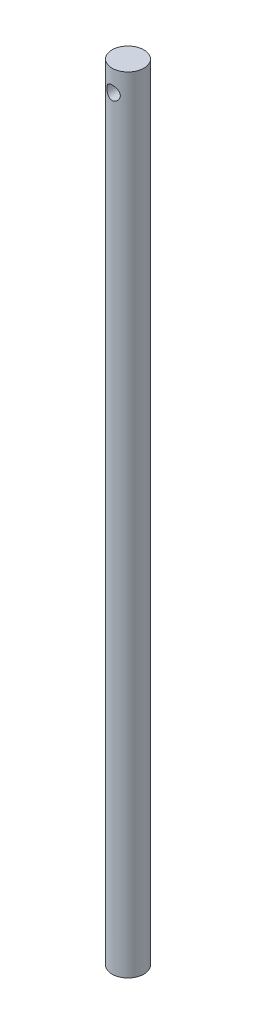
ISO-10303-21;
HEADER;
FILE_DESCRIPTION(('STEP AP214'),'2;1');
FILE_NAME('part.step','',(''),(''),'','','');
FILE_SCHEMA(('AUTOMOTIVE_DESIGN { 1 0 10303 214 1 1 1 1 }'));
ENDSEC;
DATA;
#1=APPLICATION_CONTEXT('core data for automotive mechanical design processes');
#2=APPLICATION_PROTOCOL_DEFINITION('international standard','automotive_design',2000,#1);
#3=PRODUCT_CONTEXT('',#1,'mechanical');
#4=PRODUCT('Part','Part','',(#3));
#5=PRODUCT_RELATED_PRODUCT_CATEGORY('part','',(#4));
#6=PRODUCT_DEFINITION_FORMATION('','',#4);
#7=PRODUCT_DEFINITION_CONTEXT('part definition',#1,'design');
#8=PRODUCT_DEFINITION('design','',#6,#7);
#9=PRODUCT_DEFINITION_SHAPE('','',#8);
#10=(LENGTH_UNIT() NAMED_UNIT(*) SI_UNIT(.MILLI.,.METRE.));
#11=(NAMED_UNIT(*) PLANE_ANGLE_UNIT() SI_UNIT($,.RADIAN.));
#12=(NAMED_UNIT(*) SI_UNIT($,.STERADIAN.) SOLID_ANGLE_UNIT());
#13=UNCERTAINTY_MEASURE_WITH_UNIT(LENGTH_MEASURE(1.E-05),#10,'distance_accuracy_value','');
#14=(GEOMETRIC_REPRESENTATION_CONTEXT(3) GLOBAL_UNCERTAINTY_ASSIGNED_CONTEXT((#13)) GLOBAL_UNIT_ASSIGNED_CONTEXT((#10,
#11,#12)) REPRESENTATION_CONTEXT('',''));
#15=CARTESIAN_POINT('',(0.,0.,0.));
#16=DIRECTION('',(0.,0.,1.));
#17=DIRECTION('',(1.,0.,0.));
#18=AXIS2_PLACEMENT_3D('',#15,#16,#17);
#19=CARTESIAN_POINT('',(0.,350.,0.));
#20=DIRECTION('',(0.,-1.,0.));
#21=DIRECTION('',(0.,0.,-1.));
#22=AXIS2_PLACEMENT_3D('',#19,#20,#21);
#23=CYLINDRICAL_SURFACE('',#22,7.5);
#24=CARTESIAN_POINT('',(0.,363.175,-7.5));
#25=CARTESIAN_POINT('',(-0.0849537393447906,363.174999027437,-7.49999927889738));
#26=CARTESIAN_POINT('',(-0.169938575805617,363.171583391742,-7.49855115899365));
#27=CARTESIAN_POINT('',(-0.339280768344003,363.157966014186,-7.49280287234516));
#28=CARTESIAN_POINT('',(-0.423637697199777,363.147760015256,-7.48850091645478));
#29=CARTESIAN_POINT('',(-0.675144239575748,363.107025540899,-7.47143325777022));
#30=CARTESIAN_POINT('',(-0.840504696285213,363.066380891222,-7.45450615925594));
#31=CARTESIAN_POINT('',(-1.16084896648374,362.959984795272,-7.41138039838054));
#32=CARTESIAN_POINT('',(-1.31586626932541,362.894319512174,-7.38521357712653));
#33=CARTESIAN_POINT('',(-1.61256732763309,362.740108291285,-7.32615198392762));
#34=CARTESIAN_POINT('',(-1.75425486783324,362.65156887508,-7.29325913018144));
#35=CARTESIAN_POINT('',(-2.02775156285035,362.449312364453,-7.22212826824714));
#36=CARTESIAN_POINT('',(-2.15878215912279,362.334606568428,-7.18371157327925));
#37=CARTESIAN_POINT('',(-2.40042232107132,362.085365662949,-7.10662273131978));
#38=CARTESIAN_POINT('',(-2.51102081097324,361.95081986933,-7.0679504574802));
#39=CARTESIAN_POINT('',(-2.71425256955041,361.65737854817,-6.99251004168218));
#40=CARTESIAN_POINT('',(-2.80567698173634,361.497589339432,-6.95594059012376));
#41=CARTESIAN_POINT('',(-2.96000314940777,361.163130990075,-6.89169215257704));
#42=CARTESIAN_POINT('',(-3.0229200648952,360.988469817064,-6.86400844352918));
#43=CARTESIAN_POINT('',(-3.11520554347033,360.63818281796,-6.82260609398428));
#44=CARTESIAN_POINT('',(-3.14607425540034,360.463028485765,-6.80826661640988));
#45=CARTESIAN_POINT('',(-3.17806432595459,360.109484614894,-6.79339766282169));
#46=CARTESIAN_POINT('',(-3.17920285979289,359.931097003707,-6.79286021333738));
#47=CARTESIAN_POINT('',(-3.15282744608716,359.591320063497,-6.80513235238212));
#48=CARTESIAN_POINT('',(-3.1275875192126,359.429708162768,-6.81688269051687));
#49=CARTESIAN_POINT('',(-3.05299533316155,359.113275842597,-6.85061143231891));
#50=CARTESIAN_POINT('',(-3.00363827857761,358.958456780506,-6.87259187008001));
#51=CARTESIAN_POINT('',(-2.88124432263249,358.656030789417,-6.92480489605199));
#52=CARTESIAN_POINT('',(-2.80771908173498,358.508651799324,-6.95520543582458));
#53=CARTESIAN_POINT('',(-2.63942233760845,358.227738178632,-7.02079722395833));
#54=CARTESIAN_POINT('',(-2.54464230737354,358.094209135893,-7.05599039279692));
#55=CARTESIAN_POINT('',(-2.32679482845334,357.832487234764,-7.13094687770383));
#56=CARTESIAN_POINT('',(-2.20197782621895,357.705783781349,-7.17084062525939));
#57=CARTESIAN_POINT('',(-1.93248482930373,357.474598126655,-7.24811282309164));
#58=CARTESIAN_POINT('',(-1.78780389524441,357.370121468831,-7.28549064430052));
#59=CARTESIAN_POINT('',(-1.47803932363261,357.184074081589,-7.35466922428214));
#60=CARTESIAN_POINT('',(-1.31254235470281,357.103127912051,-7.38631073648703));
#61=CARTESIAN_POINT('',(-0.968597828918121,356.970751981447,-7.43922127951114));
#62=CARTESIAN_POINT('',(-0.790157732160439,356.919305367481,-7.46049623163137));
#63=CARTESIAN_POINT('',(-0.437822930100598,356.850549602028,-7.48915934143935));
#64=CARTESIAN_POINT('',(-0.264384022778805,356.831242799934,-7.49735866488919));
#65=CARTESIAN_POINT('',(0.0834359633517255,356.821335848589,-7.50154988937807));
#66=CARTESIAN_POINT('',(0.257816744897189,356.830727116446,-7.49754544026793));
#67=CARTESIAN_POINT('',(0.593091468029581,356.876536386736,-7.4783027514013));
#68=CARTESIAN_POINT('',(0.754217093723025,356.911535192831,-7.46365467591747));
#69=CARTESIAN_POINT('',(1.06812299618963,357.005572682552,-7.425236370886));
#70=CARTESIAN_POINT('',(1.22090222452444,357.064614378503,-7.40146499830532));
#71=CARTESIAN_POINT('',(1.51916179990256,357.206984845611,-7.34614741577052));
#72=CARTESIAN_POINT('',(1.66426613211549,357.291013371428,-7.31438193229915));
#73=CARTESIAN_POINT('',(1.93883649390603,357.480205557682,-7.24644398844179));
#74=CARTESIAN_POINT('',(2.06829587061388,357.585378159155,-7.21026966628007));
#75=CARTESIAN_POINT('',(2.31793145146179,357.822927294615,-7.13410541779019));
#76=CARTESIAN_POINT('',(2.43672153828433,357.9567369834,-7.09403070313065));
#77=CARTESIAN_POINT('',(2.65056621083122,358.242999425661,-7.01694032629004));
#78=CARTESIAN_POINT('',(2.74561474478924,358.395456917773,-6.97992544567183));
#79=CARTESIAN_POINT('',(2.91049472001119,358.718207426787,-6.91282190430947));
#80=CARTESIAN_POINT('',(2.97989071686749,358.888750271002,-6.88285573197777));
#81=CARTESIAN_POINT('',(3.08837228074511,359.240772704157,-6.83487673646003));
#82=CARTESIAN_POINT('',(3.12748393224578,359.422242735758,-6.81685362842085));
#83=CARTESIAN_POINT('',(3.17165526230674,359.77553725108,-6.79640647115366));
#84=CARTESIAN_POINT('',(3.17915882048539,359.94699263171,-6.79286355315383));
#85=CARTESIAN_POINT('',(3.1664682524031,360.288627945797,-6.79878892367304));
#86=CARTESIAN_POINT('',(3.14627872014141,360.458808086095,-6.80825505412505));
#87=CARTESIAN_POINT('',(3.08084984994762,360.784348242693,-6.838095293153));
#88=CARTESIAN_POINT('',(3.03690246893438,360.940024680703,-6.85790515792465));
#89=CARTESIAN_POINT('',(2.92649091700259,361.241818424053,-6.90574041001405));
#90=CARTESIAN_POINT('',(2.86002037722598,361.387933011637,-6.93376812078416));
#91=CARTESIAN_POINT('',(2.70177470078667,361.676219666413,-6.99700567268439));
#92=CARTESIAN_POINT('',(2.60870019380261,361.817603581452,-7.03255001643021));
#93=CARTESIAN_POINT('',(2.40166861481118,362.083512209063,-7.10591540203988));
#94=CARTESIAN_POINT('',(2.28770393250571,362.208030748734,-7.1437372702239));
#95=CARTESIAN_POINT('',(2.03185887948211,362.446434073334,-7.22085364819701));
#96=CARTESIAN_POINT('',(1.88851308549295,362.55878562156,-7.26004077226473));
#97=CARTESIAN_POINT('',(1.58346317602772,362.757969101008,-7.33260740290957));
#98=CARTESIAN_POINT('',(1.42175077327497,362.844789448265,-7.36598427047488));
#99=CARTESIAN_POINT('',(1.1701730696487,362.952884007259,-7.40863339739838));
#100=CARTESIAN_POINT('',(1.08546093618612,362.985070184884,-7.42154597224758));
#101=CARTESIAN_POINT('',(0.913276576924182,363.042163705441,-7.44469256933631));
#102=CARTESIAN_POINT('',(0.825805685554564,363.06707450946,-7.45492786498527));
#103=CARTESIAN_POINT('',(0.648992122503955,363.109289425123,-7.47239511959085));
#104=CARTESIAN_POINT('',(0.559654612262175,363.126612187904,-7.47963444009961));
#105=CARTESIAN_POINT('',(0.379667292010145,363.153529082268,-7.49092581581997));
#106=CARTESIAN_POINT('',(0.289018481669201,363.163128814916,-7.4949801808445));
#107=CARTESIAN_POINT('',(0.16514425939675,363.170874574752,-7.49825437637679));
#108=CARTESIAN_POINT('',(0.132139167589989,363.172421116463,-7.49890857518718));
#109=CARTESIAN_POINT('',(0.0660909525998427,363.174484020645,-7.49978152826703));
#110=CARTESIAN_POINT('',(0.0330478292406926,363.175000378336,-7.50000028051592));
#111=CARTESIAN_POINT('',(0.,363.175,-7.5));
#112=B_SPLINE_CURVE_WITH_KNOTS('',3,(#24,#25,#26,#27,#28,#29,#30,#31,#32,#33,#34,#35,#36,#37,
#38,#39,#40,#41,#42,#43,#44,#45,#46,#47,#48,#49,#50,#51,#52,#53,#54,#55,#56,#57,#58,#59,#60,#61,
#62,#63,#64,#65,#66,#67,#68,#69,#70,#71,#72,#73,#74,#75,#76,#77,#78,#79,#80,#81,#82,#83,#84,#85,
#86,#87,#88,#89,#90,#91,#92,#93,#94,#95,#96,#97,#98,#99,#100,#101,#102,#103,#104,#105,#106,#107,
#108,#109,#110,#111),.UNSPECIFIED.,.T.,.F.,(4,2,2,2,2,2,2,2,2,2,2,2,2,2,2,2,2,2,2,2,2,2,2,2,2,2,
2,2,2,2,2,2,2,2,2,2,2,2,2,2,2,2,2,4),(0.,0.254824950445977,0.509809808593136,1.02044528252284,
1.52933795305283,2.03808569427474,2.57077278819339,3.10374779761641,3.66399492847319,
4.22394377481454,4.75630487509413,5.28835842194303,5.77805121724278,6.26784142184819,
6.7682084325476,7.26877654096393,7.81314709868608,8.35765326594633,8.91551251107546,
9.47305273658608,9.99443249842763,10.5156563435986,11.0099922617769,11.5043901341841,
12.014200538028,12.5242269767311,13.07182014096,13.6195527455964,14.1761969933063,
14.7323612578198,15.2446310513979,15.7568158749557,16.2435997945316,16.7305214766885,
17.2472339860834,17.7641351094884,18.3204229666499,18.8769628335902,19.1512667082282,
19.4254398759443,19.698935301564,19.9722321975721,20.0713611168665,20.1704904961446),.UNSPECIFIED.);
#113=CARTESIAN_POINT('',(0.,363.175,-7.5));
#114=VERTEX_POINT('',#113);
#115=EDGE_CURVE('E10',#114,#114,#112,.T.);
#116=ORIENTED_EDGE('',*,*,#115,.T.);
#117=EDGE_LOOP('',(#116));
#118=FACE_BOUND('',#117,.T.);
#119=CARTESIAN_POINT('',(3.175,360.,6.79480500088119));
#120=CARTESIAN_POINT('',(3.17499902769753,359.915430900978,6.79480592479135));
#121=CARTESIAN_POINT('',(3.17161393368909,359.830829385579,6.7963910790618));
#122=CARTESIAN_POINT('',(3.15812121072142,359.662265273449,6.80266966020106));
#123=CARTESIAN_POINT('',(3.14800928391382,359.578303119923,6.80736507424129));
#124=CARTESIAN_POINT('',(3.10766128717909,359.327996144172,6.82593533716094));
#125=CARTESIAN_POINT('',(3.06741335686323,359.163469580731,6.84429358199628));
#126=CARTESIAN_POINT('',(2.96217347341572,358.844902309719,6.89048283546659));
#127=CARTESIAN_POINT('',(2.89728459964222,358.690821029081,6.91827433167674));
#128=CARTESIAN_POINT('',(2.74490950674134,358.395736733804,6.98013009876279));
#129=CARTESIAN_POINT('',(2.65742812592761,358.254730927755,7.01419302612825));
#130=CARTESIAN_POINT('',(2.45634014045216,357.980701703484,7.08720434746051));
#131=CARTESIAN_POINT('',(2.34150770946106,357.848623021958,7.12632179173723));
#132=CARTESIAN_POINT('',(2.0915496834498,357.604894584174,7.20364688037777));
#133=CARTESIAN_POINT('',(1.95641615347533,357.493252853992,7.24185416219711));
#134=CARTESIAN_POINT('',(1.66222286285652,357.288700378356,7.31511986658547));
#135=CARTESIAN_POINT('',(1.5023597427809,357.196859395753,7.34995903897652));
#136=CARTESIAN_POINT('',(1.16771032857028,357.04178435314,7.41048559789709));
#137=CARTESIAN_POINT('',(0.992930905306274,356.978537205647,7.43617717016388));
#138=CARTESIAN_POINT('',(0.643330116870839,356.885890386274,7.47431388130434));
#139=CARTESIAN_POINT('',(0.469011474154835,356.854860591337,7.48739428970795));
#140=CARTESIAN_POINT('',(0.117184083163207,356.822254403013,7.50114716065299));
#141=CARTESIAN_POINT('',(-0.0603232956027697,356.820665654235,7.50182482819475));
#142=CARTESIAN_POINT('',(-0.401607812778261,356.846148810441,7.49106466843887));
#143=CARTESIAN_POINT('',(-0.565547280667663,356.871427527887,7.4803848374161));
#144=CARTESIAN_POINT('',(-0.886601678761174,356.946844283256,7.44915847119779));
#145=CARTESIAN_POINT('',(-1.0437161041848,356.996984156518,7.42861120755669));
#146=CARTESIAN_POINT('',(-1.34955632028785,357.121285335305,7.37923311055428));
#147=CARTESIAN_POINT('',(-1.49811709492483,357.195802245764,7.35028041171195));
#148=CARTESIAN_POINT('',(-1.78101583694861,357.366386868246,7.28690809014152));
#149=CARTESIAN_POINT('',(-1.91534870329496,357.462462271257,7.25248651767673));
#150=CARTESIAN_POINT('',(-2.17632064656416,357.681522564729,7.17867187063556));
#151=CARTESIAN_POINT('',(-2.30169770519083,357.805952503427,7.13909928935915));
#152=CARTESIAN_POINT('',(-2.53036179678076,358.074132329802,7.06129510686831));
#153=CARTESIAN_POINT('',(-2.63363974820766,358.217890120817,7.02306406232756));
#154=CARTESIAN_POINT('',(-2.81856299225412,358.526956750178,6.95096537520466));
#155=CARTESIAN_POINT('',(-2.89932894621193,358.692842048295,6.91729623137692));
#156=CARTESIAN_POINT('',(-3.03126018068542,359.037661820159,6.86051609543856));
#157=CARTESIAN_POINT('',(-3.08244742024961,359.21658650213,6.83739727352444));
#158=CARTESIAN_POINT('',(-3.1505021822026,359.569744951687,6.80629518895016));
#159=CARTESIAN_POINT('',(-3.16942130614889,359.743502394211,6.79740953250564));
#160=CARTESIAN_POINT('',(-3.17844505696361,360.091899138643,6.79319724657643));
#161=CARTESIAN_POINT('',(-3.16856020036231,360.266538095463,6.79786566840283));
#162=CARTESIAN_POINT('',(-3.12213037340802,360.599396512274,6.81930078237344));
#163=CARTESIAN_POINT('',(-3.08741669384951,360.757931952005,6.83523562011378));
#164=CARTESIAN_POINT('',(-2.99476234278639,361.066786703853,6.87633242245275));
#165=CARTESIAN_POINT('',(-2.93681612460052,361.217104044185,6.90149659039691));
#166=CARTESIAN_POINT('',(-2.79658478709629,361.512486062608,6.9595323027267));
#167=CARTESIAN_POINT('',(-2.71336025096172,361.657046952023,6.99268873192227));
#168=CARTESIAN_POINT('',(-2.52585918990408,361.930860470265,7.06258001828772));
#169=CARTESIAN_POINT('',(-2.42157334916566,362.060106284661,7.09931645522914));
#170=CARTESIAN_POINT('',(-2.18452308839474,362.310999925747,7.17597594358921));
#171=CARTESIAN_POINT('',(-2.05009627628866,362.431081303163,7.21590579517842));
#172=CARTESIAN_POINT('',(-1.76208904129449,362.64727897391,7.29158341216959));
#173=CARTESIAN_POINT('',(-1.60850693616276,362.743393160183,7.32733080972775));
#174=CARTESIAN_POINT('',(-1.28521777830144,362.908938889139,7.39090133272333));
#175=CARTESIAN_POINT('',(-1.11545107472028,362.978266561075,7.41869350419071));
#176=CARTESIAN_POINT('',(-0.765181228027982,363.086856867387,7.46294693789767));
#177=CARTESIAN_POINT('',(-0.584684778073312,363.126138036852,7.47941518500581));
#178=CARTESIAN_POINT('',(-0.232056369784012,363.171131718855,7.49833838519054));
#179=CARTESIAN_POINT('',(-0.0602535301248513,363.179050662454,7.50171405502617));
#180=CARTESIAN_POINT('',(0.28218212923216,363.167070018898,7.49664411193258));
#181=CARTESIAN_POINT('',(0.452815160038355,363.14717559134,7.48820069153664));
#182=CARTESIAN_POINT('',(0.781459320623523,363.081717216503,7.46093315658553));
#183=CARTESIAN_POINT('',(0.939703819623668,363.037143754602,7.44251015182209));
#184=CARTESIAN_POINT('',(1.24639542192167,362.92469070399,7.39733385396712));
#185=CARTESIAN_POINT('',(1.39484068963976,362.856806763476,7.37057900550129));
#186=CARTESIAN_POINT('',(1.68516230731822,362.696222740893,7.30980335205187));
#187=CARTESIAN_POINT('',(1.82643319130802,362.602534747066,7.27550751308752));
#188=CARTESIAN_POINT('',(2.09185924480881,362.394412760887,7.20368391501959));
#189=CARTESIAN_POINT('',(2.21600778744972,362.279970775552,7.16615491366194));
#190=CARTESIAN_POINT('',(2.45278027682946,362.024104176837,7.08875620658716));
#191=CARTESIAN_POINT('',(2.56397153247848,361.881344915515,7.04890833101845));
#192=CARTESIAN_POINT('',(2.76108531304583,361.577884699065,6.97406459383531));
#193=CARTESIAN_POINT('',(2.84699341069114,361.417173571976,6.93907150849555));
#194=CARTESIAN_POINT('',(2.95447850730045,361.166176995556,6.89366033023119));
#195=CARTESIAN_POINT('',(2.98672038360425,361.080955201945,6.87971442255334));
#196=CARTESIAN_POINT('',(3.04384946911058,360.9076944068,6.85463038345457));
#197=CARTESIAN_POINT('',(3.06874030307195,360.819656817535,6.84349086861622));
#198=CARTESIAN_POINT('',(3.11082402880256,360.641672953441,6.82446379439126));
#199=CARTESIAN_POINT('',(3.12803721679017,360.551732377318,6.81656766539023));
#200=CARTESIAN_POINT('',(3.15463507194668,360.370508875055,6.8042997413868));
#201=CARTESIAN_POINT('',(3.16402577749886,360.279227039767,6.79992522804291));
#202=CARTESIAN_POINT('',(3.1712975034606,360.156455707882,6.79653397795858));
#203=CARTESIAN_POINT('',(3.17268547788138,360.125185675088,6.7958861044373));
#204=CARTESIAN_POINT('',(3.17453691205101,360.062611909414,6.79502144211736));
#205=CARTESIAN_POINT('',(3.17500035995437,360.031308176106,6.79480465884205));
#206=CARTESIAN_POINT('',(3.175,360.,6.79480500088119));
#207=B_SPLINE_CURVE_WITH_KNOTS('',3,(#119,#120,#121,#122,#123,#124,#125,#126,#127,#128,#129,
#130,#131,#132,#133,#134,#135,#136,#137,#138,#139,#140,#141,#142,#143,#144,#145,#146,#147,#148,
#149,#150,#151,#152,#153,#154,#155,#156,#157,#158,#159,#160,#161,#162,#163,#164,#165,#166,#167,
#168,#169,#170,#171,#172,#173,#174,#175,#176,#177,#178,#179,#180,#181,#182,#183,#184,#185,#186,
#187,#188,#189,#190,#191,#192,#193,#194,#195,#196,#197,#198,#199,#200,#201,#202,#203,#204,#205,
#206),.UNSPECIFIED.,.T.,.F.,(4,2,2,2,2,2,2,2,2,2,2,2,2,2,2,2,2,2,2,2,2,2,2,2,2,2,2,2,2,2,2,2,2,
2,2,2,2,2,2,2,2,2,2,4),(0.,0.253672115257391,0.507506460312903,1.01588175227647,1.5221533989452,
2.02831671444393,2.56399142901327,3.09987606654677,3.65989029680336,4.21964794675568,
4.7494521076777,5.27903392306097,5.77536610848621,6.27173494038131,6.77569411562387,
7.27983336482315,7.82048802918631,8.36136444844453,8.92109054423394,9.48040056731325,
10.0026038029378,10.5246164024818,11.0116412860795,11.4987825143426,12.0068704787973,
12.5151836743741,13.0664764684379,13.6178177119132,14.1712759476178,14.7243924900106,
15.2378209037472,15.7511540851358,16.2452391271698,16.7394164594992,17.2560606758506,
17.7729042915391,18.3262415773839,18.8798940033715,19.1561160587298,19.4322016822153,
19.7075530708565,19.9826917109151,20.0766020114199,20.1705135151424),.UNSPECIFIED.);
#208=CARTESIAN_POINT('',(3.175,360.,6.79480500088119));
#209=VERTEX_POINT('',#208);
#210=EDGE_CURVE('E55',#209,#209,#207,.T.);
#211=ORIENTED_EDGE('',*,*,#210,.T.);
#212=EDGE_LOOP('',(#211));
#213=FACE_BOUND('',#212,.T.);
#214=CARTESIAN_POINT('',(0.,0.,0.));
#215=DIRECTION('',(0.,1.,0.));
#216=DIRECTION('',(0.,0.,1.));
#217=AXIS2_PLACEMENT_3D('',#214,#215,#216);
#218=CIRCLE('',#217,7.5);
#219=CARTESIAN_POINT('',(0.,0.,7.5));
#220=VERTEX_POINT('',#219);
#221=EDGE_CURVE('E60',#220,#220,#218,.T.);
#222=ORIENTED_EDGE('',*,*,#221,.T.);
#223=EDGE_LOOP('',(#222));
#224=FACE_BOUND('',#223,.T.);
#225=CARTESIAN_POINT('',(0.,370.,0.));
#226=DIRECTION('',(0.,1.,0.));
#227=DIRECTION('',(0.,0.,1.));
#228=AXIS2_PLACEMENT_3D('',#225,#226,#227);
#229=CIRCLE('',#228,7.5);
#230=CARTESIAN_POINT('',(0.,370.,7.5));
#231=VERTEX_POINT('',#230);
#232=EDGE_CURVE('E65',#231,#231,#229,.T.);
#233=ORIENTED_EDGE('',*,*,#232,.F.);
#234=EDGE_LOOP('',(#233));
#235=FACE_BOUND('',#234,.T.);
#236=ADVANCED_FACE('F43',(#118,#213,#224,#235),#23,.T.);
#237=CARTESIAN_POINT('',(0.,0.,0.));
#238=DIRECTION('',(0.,1.,0.));
#239=DIRECTION('',(0.,0.,1.));
#240=AXIS2_PLACEMENT_3D('',#237,#238,#239);
#241=PLANE('',#240);
#242=ORIENTED_EDGE('',*,*,#221,.F.);
#243=EDGE_LOOP('',(#242));
#244=FACE_BOUND('',#243,.T.);
#245=ADVANCED_FACE('F79',(#244),#241,.F.);
#246=CARTESIAN_POINT('',(0.,370.,0.));
#247=DIRECTION('',(0.,1.,0.));
#248=DIRECTION('',(0.,0.,1.));
#249=AXIS2_PLACEMENT_3D('',#246,#247,#248);
#250=PLANE('',#249);
#251=ORIENTED_EDGE('',*,*,#232,.T.);
#252=EDGE_LOOP('',(#251));
#253=FACE_BOUND('',#252,.T.);
#254=ADVANCED_FACE('F75',(#253),#250,.T.);
#255=CARTESIAN_POINT('',(0.,360.,-7.5));
#256=DIRECTION('',(0.,0.,1.));
#257=DIRECTION('',(1.,0.,0.));
#258=AXIS2_PLACEMENT_3D('',#255,#256,#257);
#259=CYLINDRICAL_SURFACE('',#258,3.175);
#260=ORIENTED_EDGE('',*,*,#210,.F.);
#261=EDGE_LOOP('',(#260));
#262=FACE_BOUND('',#261,.T.);
#263=ORIENTED_EDGE('',*,*,#115,.F.);
#264=EDGE_LOOP('',(#263));
#265=FACE_BOUND('',#264,.T.);
#266=ADVANCED_FACE('F71',(#262,#265),#259,.F.);
#267=CLOSED_SHELL('',(#236,#245,#254,#266));
#268=MANIFOLD_SOLID_BREP('B2',#267);
#269=ADVANCED_BREP_SHAPE_REPRESENTATION('',(#18,#268),#14);
#270=SHAPE_DEFINITION_REPRESENTATION(#9,#269);
ENDSEC;
END-ISO-10303-21;
